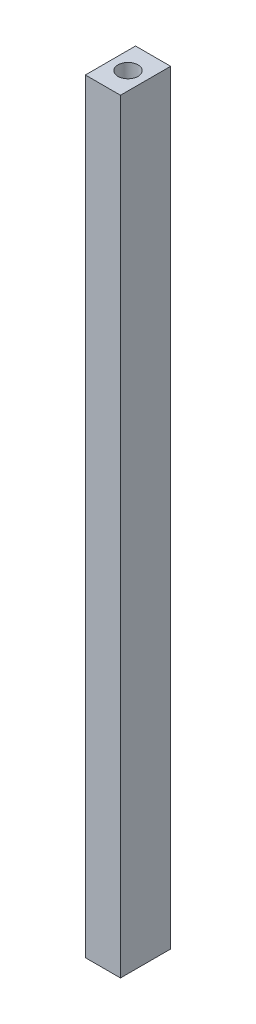
ISO-10303-21;
HEADER;
FILE_DESCRIPTION(('STEP AP214'),'2;1');
FILE_NAME('part.step','',(''),(''),'','','');
FILE_SCHEMA(('AUTOMOTIVE_DESIGN { 1 0 10303 214 1 1 1 1 }'));
ENDSEC;
DATA;
#1=APPLICATION_CONTEXT('core data for automotive mechanical design processes');
#2=APPLICATION_PROTOCOL_DEFINITION('international standard','automotive_design',2000,#1);
#3=PRODUCT_CONTEXT('',#1,'mechanical');
#4=PRODUCT('Part','Part','',(#3));
#5=PRODUCT_RELATED_PRODUCT_CATEGORY('part','',(#4));
#6=PRODUCT_DEFINITION_FORMATION('','',#4);
#7=PRODUCT_DEFINITION_CONTEXT('part definition',#1,'design');
#8=PRODUCT_DEFINITION('design','',#6,#7);
#9=PRODUCT_DEFINITION_SHAPE('','',#8);
#10=(LENGTH_UNIT() NAMED_UNIT(*) SI_UNIT(.MILLI.,.METRE.));
#11=(NAMED_UNIT(*) PLANE_ANGLE_UNIT() SI_UNIT($,.RADIAN.));
#12=(NAMED_UNIT(*) SI_UNIT($,.STERADIAN.) SOLID_ANGLE_UNIT());
#13=UNCERTAINTY_MEASURE_WITH_UNIT(LENGTH_MEASURE(1.E-05),#10,'distance_accuracy_value','');
#14=(GEOMETRIC_REPRESENTATION_CONTEXT(3) GLOBAL_UNCERTAINTY_ASSIGNED_CONTEXT((#13)) GLOBAL_UNIT_ASSIGNED_CONTEXT((#10,
#11,#12)) REPRESENTATION_CONTEXT('',''));
#15=CARTESIAN_POINT('',(0.,0.,0.));
#16=DIRECTION('',(0.,0.,1.));
#17=DIRECTION('',(1.,0.,0.));
#18=AXIS2_PLACEMENT_3D('',#15,#16,#17);
#19=CARTESIAN_POINT('',(3.5,76.2,5.));
#20=DIRECTION('',(-1.,0.,0.));
#21=DIRECTION('',(0.,0.,1.));
#22=AXIS2_PLACEMENT_3D('',#19,#20,#21);
#23=PLANE('',#22);
#24=DIRECTION('',(0.,0.,-1.));
#25=VECTOR('',#24,1.);
#26=CARTESIAN_POINT('',(3.5,-76.2,5.));
#27=LINE('',#26,#25);
#28=CARTESIAN_POINT('',(3.5,-76.2,5.));
#29=VERTEX_POINT('',#28);
#30=CARTESIAN_POINT('',(3.5,-76.2,-5.));
#31=VERTEX_POINT('',#30);
#32=EDGE_CURVE('E97',#29,#31,#27,.T.);
#33=ORIENTED_EDGE('',*,*,#32,.T.);
#34=DIRECTION('',(0.,-1.,0.));
#35=VECTOR('',#34,1.);
#36=CARTESIAN_POINT('',(3.5,76.2,-5.));
#37=LINE('',#36,#35);
#38=CARTESIAN_POINT('',(3.5,76.2,-5.));
#39=VERTEX_POINT('',#38);
#40=EDGE_CURVE('E11',#39,#31,#37,.T.);
#41=ORIENTED_EDGE('',*,*,#40,.F.);
#42=DIRECTION('',(0.,0.,-1.));
#43=VECTOR('',#42,1.);
#44=CARTESIAN_POINT('',(3.5,76.2,5.));
#45=LINE('',#44,#43);
#46=CARTESIAN_POINT('',(3.5,76.2,5.));
#47=VERTEX_POINT('',#46);
#48=EDGE_CURVE('E85',#47,#39,#45,.T.);
#49=ORIENTED_EDGE('',*,*,#48,.F.);
#50=DIRECTION('',(0.,-1.,0.));
#51=VECTOR('',#50,1.);
#52=CARTESIAN_POINT('',(3.5,76.2,5.));
#53=LINE('',#52,#51);
#54=EDGE_CURVE('E93',#47,#29,#53,.T.);
#55=ORIENTED_EDGE('',*,*,#54,.T.);
#56=EDGE_LOOP('',(#33,#41,#49,#55));
#57=FACE_BOUND('',#56,.T.);
#58=ADVANCED_FACE('F34',(#57),#23,.F.);
#59=CARTESIAN_POINT('',(-3.5,76.2,-5.));
#60=DIRECTION('',(0.,0.,1.));
#61=DIRECTION('',(1.,0.,0.));
#62=AXIS2_PLACEMENT_3D('',#59,#60,#61);
#63=PLANE('',#62);
#64=DIRECTION('',(-1.,0.,0.));
#65=VECTOR('',#64,1.);
#66=CARTESIAN_POINT('',(-3.5,-76.2,-5.));
#67=LINE('',#66,#65);
#68=CARTESIAN_POINT('',(-3.5,-76.2,-5.));
#69=VERTEX_POINT('',#68);
#70=EDGE_CURVE('E89',#31,#69,#67,.T.);
#71=ORIENTED_EDGE('',*,*,#70,.T.);
#72=DIRECTION('',(0.,-1.,0.));
#73=VECTOR('',#72,1.);
#74=CARTESIAN_POINT('',(-3.5,76.2,-5.));
#75=LINE('',#74,#73);
#76=CARTESIAN_POINT('',(-3.5,76.2,-5.));
#77=VERTEX_POINT('',#76);
#78=EDGE_CURVE('E42',#77,#69,#75,.T.);
#79=ORIENTED_EDGE('',*,*,#78,.F.);
#80=DIRECTION('',(-1.,0.,0.));
#81=VECTOR('',#80,1.);
#82=CARTESIAN_POINT('',(-3.5,76.2,-5.));
#83=LINE('',#82,#81);
#84=EDGE_CURVE('E80',#39,#77,#83,.T.);
#85=ORIENTED_EDGE('',*,*,#84,.F.);
#86=ORIENTED_EDGE('',*,*,#40,.T.);
#87=EDGE_LOOP('',(#71,#79,#85,#86));
#88=FACE_BOUND('',#87,.T.);
#89=ADVANCED_FACE('F88',(#88),#63,.F.);
#90=CARTESIAN_POINT('',(-3.5,76.2,5.));
#91=DIRECTION('',(1.,0.,0.));
#92=DIRECTION('',(0.,0.,-1.));
#93=AXIS2_PLACEMENT_3D('',#90,#91,#92);
#94=PLANE('',#93);
#95=DIRECTION('',(0.,0.,1.));
#96=VECTOR('',#95,1.);
#97=CARTESIAN_POINT('',(-3.5,-76.2,5.));
#98=LINE('',#97,#96);
#99=CARTESIAN_POINT('',(-3.5,-76.2,5.));
#100=VERTEX_POINT('',#99);
#101=EDGE_CURVE('E67',#69,#100,#98,.T.);
#102=ORIENTED_EDGE('',*,*,#101,.T.);
#103=DIRECTION('',(0.,-1.,0.));
#104=VECTOR('',#103,1.);
#105=CARTESIAN_POINT('',(-3.5,76.2,5.));
#106=LINE('',#105,#104);
#107=CARTESIAN_POINT('',(-3.5,76.2,5.));
#108=VERTEX_POINT('',#107);
#109=EDGE_CURVE('E90',#108,#100,#106,.T.);
#110=ORIENTED_EDGE('',*,*,#109,.F.);
#111=DIRECTION('',(0.,0.,1.));
#112=VECTOR('',#111,1.);
#113=CARTESIAN_POINT('',(-3.5,76.2,5.));
#114=LINE('',#113,#112);
#115=EDGE_CURVE('E83',#77,#108,#114,.T.);
#116=ORIENTED_EDGE('',*,*,#115,.F.);
#117=ORIENTED_EDGE('',*,*,#78,.T.);
#118=EDGE_LOOP('',(#102,#110,#116,#117));
#119=FACE_BOUND('',#118,.T.);
#120=ADVANCED_FACE('F91',(#119),#94,.F.);
#121=CARTESIAN_POINT('',(-3.5,76.2,5.));
#122=DIRECTION('',(0.,0.,-1.));
#123=DIRECTION('',(-1.,0.,0.));
#124=AXIS2_PLACEMENT_3D('',#121,#122,#123);
#125=PLANE('',#124);
#126=DIRECTION('',(1.,0.,0.));
#127=VECTOR('',#126,1.);
#128=CARTESIAN_POINT('',(-3.5,-76.2,5.));
#129=LINE('',#128,#127);
#130=EDGE_CURVE('E73',#100,#29,#129,.T.);
#131=ORIENTED_EDGE('',*,*,#130,.T.);
#132=ORIENTED_EDGE('',*,*,#54,.F.);
#133=DIRECTION('',(1.,0.,0.));
#134=VECTOR('',#133,1.);
#135=CARTESIAN_POINT('',(-3.5,76.2,5.));
#136=LINE('',#135,#134);
#137=EDGE_CURVE('E50',#108,#47,#136,.T.);
#138=ORIENTED_EDGE('',*,*,#137,.F.);
#139=ORIENTED_EDGE('',*,*,#109,.T.);
#140=EDGE_LOOP('',(#131,#132,#138,#139));
#141=FACE_BOUND('',#140,.T.);
#142=ADVANCED_FACE('F105',(#141),#125,.F.);
#143=CARTESIAN_POINT('',(0.,76.2,0.));
#144=DIRECTION('',(0.,-1.,0.));
#145=DIRECTION('',(0.,0.,-1.));
#146=AXIS2_PLACEMENT_3D('',#143,#144,#145);
#147=PLANE('',#146);
#148=CARTESIAN_POINT('',(0.,76.2,0.));
#149=DIRECTION('',(0.,-1.,0.));
#150=DIRECTION('',(0.,0.,-1.));
#151=AXIS2_PLACEMENT_3D('',#148,#149,#150);
#152=CIRCLE('',#151,2.);
#153=CARTESIAN_POINT('',(0.,76.2,2.));
#154=VERTEX_POINT('',#153);
#155=EDGE_CURVE('E117',#154,#154,#152,.T.);
#156=ORIENTED_EDGE('',*,*,#155,.T.);
#157=EDGE_LOOP('',(#156));
#158=FACE_BOUND('',#157,.T.);
#159=ORIENTED_EDGE('',*,*,#48,.T.);
#160=ORIENTED_EDGE('',*,*,#84,.T.);
#161=ORIENTED_EDGE('',*,*,#115,.T.);
#162=ORIENTED_EDGE('',*,*,#137,.T.);
#163=EDGE_LOOP('',(#159,#160,#161,#162));
#164=FACE_BOUND('',#163,.T.);
#165=ADVANCED_FACE('F81',(#158,#164),#147,.F.);
#166=CARTESIAN_POINT('',(0.,-76.2,0.));
#167=DIRECTION('',(0.,-1.,0.));
#168=DIRECTION('',(0.,0.,-1.));
#169=AXIS2_PLACEMENT_3D('',#166,#167,#168);
#170=PLANE('',#169);
#171=CARTESIAN_POINT('',(0.,-76.2,0.));
#172=DIRECTION('',(0.,-1.,0.));
#173=DIRECTION('',(0.,0.,-1.));
#174=AXIS2_PLACEMENT_3D('',#171,#172,#173);
#175=CIRCLE('',#174,2.);
#176=CARTESIAN_POINT('',(0.,-76.2,-2.));
#177=VERTEX_POINT('',#176);
#178=EDGE_CURVE('E111',#177,#177,#175,.T.);
#179=ORIENTED_EDGE('',*,*,#178,.F.);
#180=EDGE_LOOP('',(#179));
#181=FACE_BOUND('',#180,.T.);
#182=ORIENTED_EDGE('',*,*,#32,.F.);
#183=ORIENTED_EDGE('',*,*,#130,.F.);
#184=ORIENTED_EDGE('',*,*,#101,.F.);
#185=ORIENTED_EDGE('',*,*,#70,.F.);
#186=EDGE_LOOP('',(#182,#183,#184,#185));
#187=FACE_BOUND('',#186,.T.);
#188=ADVANCED_FACE('F108',(#181,#187),#170,.T.);
#189=CARTESIAN_POINT('',(0.,-63.2,0.));
#190=DIRECTION('',(0.,-1.,0.));
#191=DIRECTION('',(0.,0.,-1.));
#192=AXIS2_PLACEMENT_3D('',#189,#190,#191);
#193=CYLINDRICAL_SURFACE('',#192,2.);
#194=CARTESIAN_POINT('',(0.,-63.2,0.));
#195=DIRECTION('',(0.,-1.,0.));
#196=DIRECTION('',(0.,0.,-1.));
#197=AXIS2_PLACEMENT_3D('',#194,#195,#196);
#198=CIRCLE('',#197,2.);
#199=CARTESIAN_POINT('',(0.,-63.2,-2.));
#200=VERTEX_POINT('',#199);
#201=EDGE_CURVE('E100',#200,#200,#198,.T.);
#202=CARTESIAN_POINT('',(0.,-63.2,-2.));
#203=CARTESIAN_POINT('',(0.,-63.3354166666667,-2.));
#204=CARTESIAN_POINT('',(0.,-63.4708333333333,-2.));
#205=CARTESIAN_POINT('',(0.,-63.7416666666667,-2.));
#206=CARTESIAN_POINT('',(0.,-63.8770833333333,-2.));
#207=CARTESIAN_POINT('',(0.,-64.1479166666667,-2.));
#208=CARTESIAN_POINT('',(0.,-64.2833333333333,-2.));
#209=CARTESIAN_POINT('',(0.,-64.5541666666667,-2.));
#210=CARTESIAN_POINT('',(0.,-64.6895833333333,-2.));
#211=CARTESIAN_POINT('',(0.,-64.9604166666667,-2.));
#212=CARTESIAN_POINT('',(0.,-65.0958333333333,-2.));
#213=CARTESIAN_POINT('',(0.,-65.3666666666667,-2.));
#214=CARTESIAN_POINT('',(0.,-65.5020833333333,-2.));
#215=CARTESIAN_POINT('',(0.,-65.7729166666667,-2.));
#216=CARTESIAN_POINT('',(0.,-65.9083333333333,-2.));
#217=CARTESIAN_POINT('',(0.,-66.1791666666667,-2.));
#218=CARTESIAN_POINT('',(0.,-66.3145833333333,-2.));
#219=CARTESIAN_POINT('',(0.,-66.5854166666667,-2.));
#220=CARTESIAN_POINT('',(0.,-66.7208333333333,-2.));
#221=CARTESIAN_POINT('',(0.,-66.9916666666667,-2.));
#222=CARTESIAN_POINT('',(0.,-67.1270833333333,-2.));
#223=CARTESIAN_POINT('',(0.,-67.3979166666667,-2.));
#224=CARTESIAN_POINT('',(0.,-67.5333333333333,-2.));
#225=CARTESIAN_POINT('',(0.,-67.8041666666667,-2.));
#226=CARTESIAN_POINT('',(0.,-67.9395833333333,-2.));
#227=CARTESIAN_POINT('',(0.,-68.2104166666667,-2.));
#228=CARTESIAN_POINT('',(0.,-68.3458333333333,-2.));
#229=CARTESIAN_POINT('',(0.,-68.6166666666667,-2.));
#230=CARTESIAN_POINT('',(0.,-68.7520833333333,-2.));
#231=CARTESIAN_POINT('',(0.,-69.0229166666667,-2.));
#232=CARTESIAN_POINT('',(0.,-69.1583333333333,-2.));
#233=CARTESIAN_POINT('',(0.,-69.4291666666667,-2.));
#234=CARTESIAN_POINT('',(0.,-69.5645833333333,-2.));
#235=CARTESIAN_POINT('',(0.,-69.8354166666667,-2.));
#236=CARTESIAN_POINT('',(0.,-69.9708333333333,-2.));
#237=CARTESIAN_POINT('',(0.,-70.2416666666667,-2.));
#238=CARTESIAN_POINT('',(0.,-70.3770833333333,-2.));
#239=CARTESIAN_POINT('',(0.,-70.6479166666667,-2.));
#240=CARTESIAN_POINT('',(0.,-70.7833333333333,-2.));
#241=CARTESIAN_POINT('',(0.,-71.0541666666667,-2.));
#242=CARTESIAN_POINT('',(0.,-71.1895833333333,-2.));
#243=CARTESIAN_POINT('',(0.,-71.4604166666667,-2.));
#244=CARTESIAN_POINT('',(0.,-71.5958333333333,-2.));
#245=CARTESIAN_POINT('',(0.,-71.8666666666667,-2.));
#246=CARTESIAN_POINT('',(0.,-72.0020833333333,-2.));
#247=CARTESIAN_POINT('',(0.,-72.2729166666667,-2.));
#248=CARTESIAN_POINT('',(0.,-72.4083333333333,-2.));
#249=CARTESIAN_POINT('',(0.,-72.6791666666667,-2.));
#250=CARTESIAN_POINT('',(0.,-72.8145833333333,-2.));
#251=CARTESIAN_POINT('',(0.,-73.0854166666667,-2.));
#252=CARTESIAN_POINT('',(0.,-73.2208333333333,-2.));
#253=CARTESIAN_POINT('',(0.,-73.4916666666667,-2.));
#254=CARTESIAN_POINT('',(0.,-73.6270833333333,-2.));
#255=CARTESIAN_POINT('',(0.,-73.8979166666667,-2.));
#256=CARTESIAN_POINT('',(0.,-74.0333333333333,-2.));
#257=CARTESIAN_POINT('',(0.,-74.3041666666667,-2.));
#258=CARTESIAN_POINT('',(0.,-74.4395833333333,-2.));
#259=CARTESIAN_POINT('',(0.,-74.7104166666667,-2.));
#260=CARTESIAN_POINT('',(0.,-74.8458333333333,-2.));
#261=CARTESIAN_POINT('',(0.,-75.1166666666667,-2.));
#262=CARTESIAN_POINT('',(0.,-75.2520833333333,-2.));
#263=CARTESIAN_POINT('',(0.,-75.5229166666667,-2.));
#264=CARTESIAN_POINT('',(0.,-75.6583333333333,-2.));
#265=CARTESIAN_POINT('',(0.,-75.9291666666667,-2.));
#266=CARTESIAN_POINT('',(0.,-76.0645833333333,-2.));
#267=CARTESIAN_POINT('',(0.,-76.2,-2.));
#268=B_SPLINE_CURVE_WITH_KNOTS('',3,(#202,#203,#204,#205,#206,#207,#208,#209,#210,#211,#212,
#213,#214,#215,#216,#217,#218,#219,#220,#221,#222,#223,#224,#225,#226,#227,#228,#229,#230,#231,
#232,#233,#234,#235,#236,#237,#238,#239,#240,#241,#242,#243,#244,#245,#246,#247,#248,#249,#250,
#251,#252,#253,#254,#255,#256,#257,#258,#259,#260,#261,#262,#263,#264,#265,#266,#267),
.UNSPECIFIED.,.F.,.F.,(4,2,2,2,2,2,2,2,2,2,2,2,2,2,2,2,2,2,2,2,2,2,2,2,2,2,2,2,2,2,2,2,4),(0.,
0.406249999999997,0.812499999999994,1.21874999999999,1.62499999999999,2.03125,2.4375,
2.84374999999999,3.24999999999999,3.65625,4.0625,4.46874999999999,4.87499999999999,
5.28124999999999,5.6875,6.09374999999999,6.49999999999999,6.90624999999999,7.3125,7.71875,
8.12499999999999,8.53124999999999,8.93749999999999,9.34375,9.74999999999999,10.15625,10.5625,
10.96875,11.375,11.78125,12.1875,12.59375,13.),.UNSPECIFIED.);
#269=EDGE_CURVE('BSEAM147',#200,#177,#268,.T.);
#270=ORIENTED_EDGE('',*,*,#201,.F.);
#271=ORIENTED_EDGE('',*,*,#178,.T.);
#272=ORIENTED_EDGE('',*,*,#269,.T.);
#273=ORIENTED_EDGE('',*,*,#269,.F.);
#274=EDGE_LOOP('',(#270,#272,#271,#273));
#275=FACE_BOUND('',#274,.T.);
#276=ADVANCED_FACE('F147',(#275),#193,.F.);
#277=CARTESIAN_POINT('',(0.,-63.2,0.));
#278=DIRECTION('',(0.,-1.,0.));
#279=DIRECTION('',(0.,0.,-1.));
#280=AXIS2_PLACEMENT_3D('',#277,#278,#279);
#281=PLANE('',#280);
#282=ORIENTED_EDGE('',*,*,#201,.T.);
#283=EDGE_LOOP('',(#282));
#284=FACE_BOUND('',#283,.T.);
#285=ADVANCED_FACE('F132',(#284),#281,.T.);
#286=CARTESIAN_POINT('',(0.,63.2,0.));
#287=DIRECTION('',(0.,1.,0.));
#288=DIRECTION('',(0.,0.,1.));
#289=AXIS2_PLACEMENT_3D('',#286,#287,#288);
#290=CYLINDRICAL_SURFACE('',#289,2.);
#291=CARTESIAN_POINT('',(0.,63.2,0.));
#292=DIRECTION('',(0.,-1.,0.));
#293=DIRECTION('',(0.,0.,-1.));
#294=AXIS2_PLACEMENT_3D('',#291,#292,#293);
#295=CIRCLE('',#294,2.);
#296=CARTESIAN_POINT('',(0.,63.2,2.));
#297=VERTEX_POINT('',#296);
#298=EDGE_CURVE('E114',#297,#297,#295,.T.);
#299=CARTESIAN_POINT('',(0.,63.2,2.));
#300=CARTESIAN_POINT('',(0.,63.3354166666667,2.));
#301=CARTESIAN_POINT('',(0.,63.4708333333334,2.));
#302=CARTESIAN_POINT('',(0.,63.7416666666667,2.));
#303=CARTESIAN_POINT('',(0.,63.8770833333333,2.));
#304=CARTESIAN_POINT('',(0.,64.1479166666667,2.));
#305=CARTESIAN_POINT('',(0.,64.2833333333333,2.));
#306=CARTESIAN_POINT('',(0.,64.5541666666667,2.));
#307=CARTESIAN_POINT('',(0.,64.6895833333333,2.));
#308=CARTESIAN_POINT('',(0.,64.9604166666667,2.));
#309=CARTESIAN_POINT('',(0.,65.0958333333334,2.));
#310=CARTESIAN_POINT('',(0.,65.3666666666667,2.));
#311=CARTESIAN_POINT('',(0.,65.5020833333333,2.));
#312=CARTESIAN_POINT('',(0.,65.7729166666667,2.));
#313=CARTESIAN_POINT('',(0.,65.9083333333333,2.));
#314=CARTESIAN_POINT('',(0.,66.1791666666667,2.));
#315=CARTESIAN_POINT('',(0.,66.3145833333333,2.));
#316=CARTESIAN_POINT('',(0.,66.5854166666667,2.));
#317=CARTESIAN_POINT('',(0.,66.7208333333333,2.));
#318=CARTESIAN_POINT('',(0.,66.9916666666667,2.));
#319=CARTESIAN_POINT('',(0.,67.1270833333333,2.));
#320=CARTESIAN_POINT('',(0.,67.3979166666667,2.));
#321=CARTESIAN_POINT('',(0.,67.5333333333333,2.));
#322=CARTESIAN_POINT('',(0.,67.8041666666667,2.));
#323=CARTESIAN_POINT('',(0.,67.9395833333333,2.));
#324=CARTESIAN_POINT('',(0.,68.2104166666667,2.));
#325=CARTESIAN_POINT('',(0.,68.3458333333333,2.));
#326=CARTESIAN_POINT('',(0.,68.6166666666667,2.));
#327=CARTESIAN_POINT('',(0.,68.7520833333333,2.));
#328=CARTESIAN_POINT('',(0.,69.0229166666667,2.));
#329=CARTESIAN_POINT('',(0.,69.1583333333333,2.));
#330=CARTESIAN_POINT('',(0.,69.4291666666667,2.));
#331=CARTESIAN_POINT('',(0.,69.5645833333333,2.));
#332=CARTESIAN_POINT('',(0.,69.8354166666667,2.));
#333=CARTESIAN_POINT('',(0.,69.9708333333333,2.));
#334=CARTESIAN_POINT('',(0.,70.2416666666667,2.));
#335=CARTESIAN_POINT('',(0.,70.3770833333333,2.));
#336=CARTESIAN_POINT('',(0.,70.6479166666667,2.));
#337=CARTESIAN_POINT('',(0.,70.7833333333333,2.));
#338=CARTESIAN_POINT('',(0.,71.0541666666667,2.));
#339=CARTESIAN_POINT('',(0.,71.1895833333333,2.));
#340=CARTESIAN_POINT('',(0.,71.4604166666667,2.));
#341=CARTESIAN_POINT('',(0.,71.5958333333333,2.));
#342=CARTESIAN_POINT('',(0.,71.8666666666667,2.));
#343=CARTESIAN_POINT('',(0.,72.0020833333333,2.));
#344=CARTESIAN_POINT('',(0.,72.2729166666667,2.));
#345=CARTESIAN_POINT('',(0.,72.4083333333333,2.));
#346=CARTESIAN_POINT('',(0.,72.6791666666667,2.));
#347=CARTESIAN_POINT('',(0.,72.8145833333333,2.));
#348=CARTESIAN_POINT('',(0.,73.0854166666667,2.));
#349=CARTESIAN_POINT('',(0.,73.2208333333333,2.));
#350=CARTESIAN_POINT('',(0.,73.4916666666667,2.));
#351=CARTESIAN_POINT('',(0.,73.6270833333333,2.));
#352=CARTESIAN_POINT('',(0.,73.8979166666667,2.));
#353=CARTESIAN_POINT('',(0.,74.0333333333333,2.));
#354=CARTESIAN_POINT('',(0.,74.3041666666667,2.));
#355=CARTESIAN_POINT('',(0.,74.4395833333333,2.));
#356=CARTESIAN_POINT('',(0.,74.7104166666667,2.));
#357=CARTESIAN_POINT('',(0.,74.8458333333333,2.));
#358=CARTESIAN_POINT('',(0.,75.1166666666667,2.));
#359=CARTESIAN_POINT('',(0.,75.2520833333333,2.));
#360=CARTESIAN_POINT('',(0.,75.5229166666667,2.));
#361=CARTESIAN_POINT('',(0.,75.6583333333333,2.));
#362=CARTESIAN_POINT('',(0.,75.9291666666667,2.));
#363=CARTESIAN_POINT('',(0.,76.0645833333333,2.));
#364=CARTESIAN_POINT('',(0.,76.2,2.));
#365=B_SPLINE_CURVE_WITH_KNOTS('',3,(#299,#300,#301,#302,#303,#304,#305,#306,#307,#308,#309,
#310,#311,#312,#313,#314,#315,#316,#317,#318,#319,#320,#321,#322,#323,#324,#325,#326,#327,#328,
#329,#330,#331,#332,#333,#334,#335,#336,#337,#338,#339,#340,#341,#342,#343,#344,#345,#346,#347,
#348,#349,#350,#351,#352,#353,#354,#355,#356,#357,#358,#359,#360,#361,#362,#363,#364),
.UNSPECIFIED.,.F.,.F.,(4,2,2,2,2,2,2,2,2,2,2,2,2,2,2,2,2,2,2,2,2,2,2,2,2,2,2,2,2,2,2,2,4),(0.,
0.406249999999997,0.812499999999994,1.21874999999999,1.62499999999999,2.03125,2.4375,
2.84374999999999,3.24999999999999,3.65624999999999,4.0625,4.46874999999999,4.87499999999999,
5.28124999999999,5.6875,6.09374999999999,6.49999999999999,6.90624999999999,7.31249999999999,
7.71875,8.12499999999999,8.53124999999999,8.93749999999999,9.34374999999998,9.74999999999999,
10.15625,10.5625,10.96875,11.375,11.78125,12.1875,12.59375,13.),.UNSPECIFIED.);
#366=EDGE_CURVE('BSEAM123',#297,#154,#365,.T.);
#367=ORIENTED_EDGE('',*,*,#298,.T.);
#368=ORIENTED_EDGE('',*,*,#155,.F.);
#369=ORIENTED_EDGE('',*,*,#366,.T.);
#370=ORIENTED_EDGE('',*,*,#366,.F.);
#371=EDGE_LOOP('',(#367,#369,#368,#370));
#372=FACE_BOUND('',#371,.T.);
#373=ADVANCED_FACE('F123',(#372),#290,.F.);
#374=CARTESIAN_POINT('',(0.,63.2,0.));
#375=DIRECTION('',(0.,1.,0.));
#376=DIRECTION('',(0.,0.,-1.));
#377=AXIS2_PLACEMENT_3D('',#374,#375,#376);
#378=PLANE('',#377);
#379=ORIENTED_EDGE('',*,*,#298,.F.);
#380=EDGE_LOOP('',(#379));
#381=FACE_BOUND('',#380,.T.);
#382=ADVANCED_FACE('F126',(#381),#378,.T.);
#383=CLOSED_SHELL('',(#58,#89,#120,#142,#165,#188,#276,#285,#373,#382));
#384=MANIFOLD_SOLID_BREP('B2',#383);
#385=ADVANCED_BREP_SHAPE_REPRESENTATION('',(#18,#384),#14);
#386=SHAPE_DEFINITION_REPRESENTATION(#9,#385);
ENDSEC;
END-ISO-10303-21;
